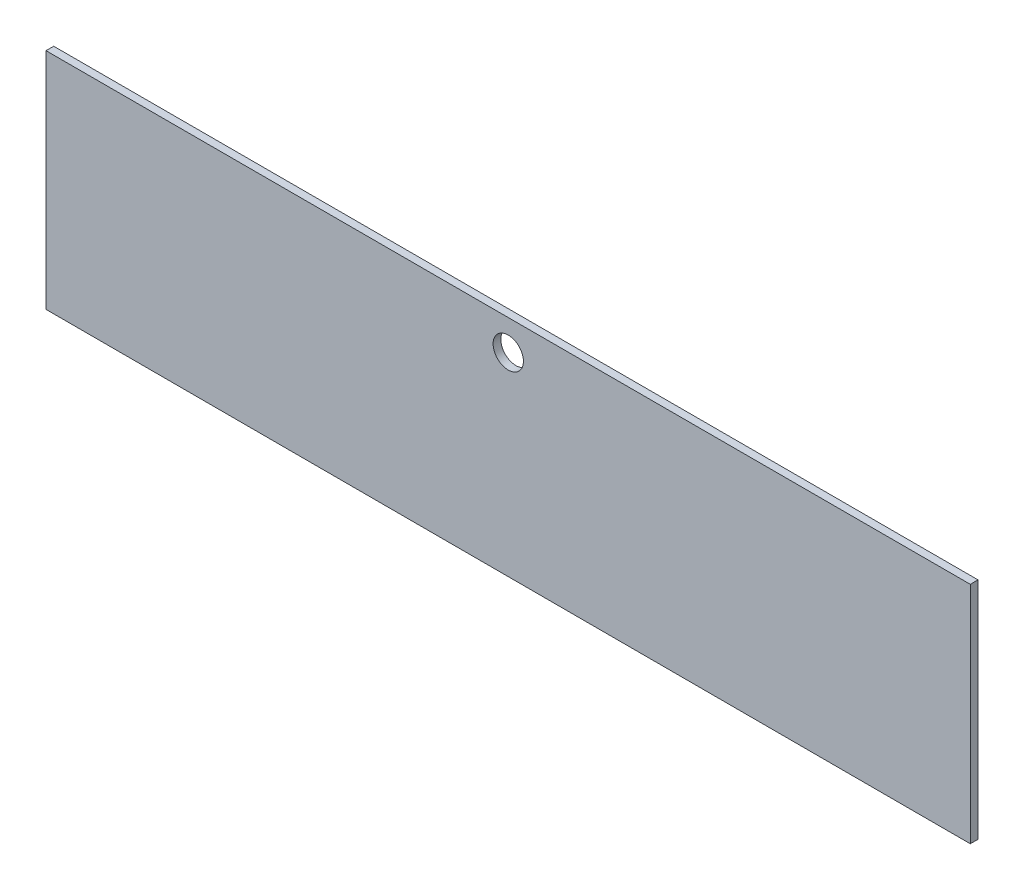
ISO-10303-21;
HEADER;
FILE_DESCRIPTION(('STEP AP214'),'2;1');
FILE_NAME('part.step','',(''),(''),'','','');
FILE_SCHEMA(('AUTOMOTIVE_DESIGN { 1 0 10303 214 1 1 1 1 }'));
ENDSEC;
DATA;
#1=APPLICATION_CONTEXT('core data for automotive mechanical design processes');
#2=APPLICATION_PROTOCOL_DEFINITION('international standard','automotive_design',2000,#1);
#3=PRODUCT_CONTEXT('',#1,'mechanical');
#4=PRODUCT('Part','Part','',(#3));
#5=PRODUCT_RELATED_PRODUCT_CATEGORY('part','',(#4));
#6=PRODUCT_DEFINITION_FORMATION('','',#4);
#7=PRODUCT_DEFINITION_CONTEXT('part definition',#1,'design');
#8=PRODUCT_DEFINITION('design','',#6,#7);
#9=PRODUCT_DEFINITION_SHAPE('','',#8);
#10=(LENGTH_UNIT() NAMED_UNIT(*) SI_UNIT(.MILLI.,.METRE.));
#11=(NAMED_UNIT(*) PLANE_ANGLE_UNIT() SI_UNIT($,.RADIAN.));
#12=(NAMED_UNIT(*) SI_UNIT($,.STERADIAN.) SOLID_ANGLE_UNIT());
#13=UNCERTAINTY_MEASURE_WITH_UNIT(LENGTH_MEASURE(1.E-05),#10,'distance_accuracy_value','');
#14=(GEOMETRIC_REPRESENTATION_CONTEXT(3) GLOBAL_UNCERTAINTY_ASSIGNED_CONTEXT((#13)) GLOBAL_UNIT_ASSIGNED_CONTEXT((#10,
#11,#12)) REPRESENTATION_CONTEXT('',''));
#15=CARTESIAN_POINT('',(0.,0.,0.));
#16=DIRECTION('',(0.,0.,1.));
#17=DIRECTION('',(1.,0.,0.));
#18=AXIS2_PLACEMENT_3D('',#15,#16,#17);
#19=CARTESIAN_POINT('',(380.905750174295,-160.265445134308,6.35));
#20=DIRECTION('',(-1.,0.,0.));
#21=DIRECTION('',(0.,0.,1.));
#22=AXIS2_PLACEMENT_3D('',#19,#20,#21);
#23=PLANE('',#22);
#24=DIRECTION('',(0.,1.,0.));
#25=VECTOR('',#24,1.);
#26=CARTESIAN_POINT('',(380.905750174295,-160.265445134308,0.));
#27=LINE('',#26,#25);
#28=CARTESIAN_POINT('',(380.905750174295,-160.265445134308,0.));
#29=VERTEX_POINT('',#28);
#30=CARTESIAN_POINT('',(380.905750174295,25.,0.));
#31=VERTEX_POINT('',#30);
#32=EDGE_CURVE('E101',#29,#31,#27,.T.);
#33=ORIENTED_EDGE('',*,*,#32,.T.);
#34=DIRECTION('',(0.,0.,-1.));
#35=VECTOR('',#34,1.);
#36=CARTESIAN_POINT('',(380.905750174295,25.,6.35));
#37=LINE('',#36,#35);
#38=CARTESIAN_POINT('',(380.905750174295,25.,6.35));
#39=VERTEX_POINT('',#38);
#40=EDGE_CURVE('E11',#39,#31,#37,.T.);
#41=ORIENTED_EDGE('',*,*,#40,.F.);
#42=DIRECTION('',(0.,1.,0.));
#43=VECTOR('',#42,1.);
#44=CARTESIAN_POINT('',(380.905750174295,-160.265445134308,6.35));
#45=LINE('',#44,#43);
#46=CARTESIAN_POINT('',(380.905750174295,-160.265445134308,6.35));
#47=VERTEX_POINT('',#46);
#48=EDGE_CURVE('E89',#47,#39,#45,.T.);
#49=ORIENTED_EDGE('',*,*,#48,.F.);
#50=DIRECTION('',(0.,0.,-1.));
#51=VECTOR('',#50,1.);
#52=CARTESIAN_POINT('',(380.905750174295,-160.265445134308,6.35));
#53=LINE('',#52,#51);
#54=EDGE_CURVE('E97',#47,#29,#53,.T.);
#55=ORIENTED_EDGE('',*,*,#54,.T.);
#56=EDGE_LOOP('',(#33,#41,#49,#55));
#57=FACE_BOUND('',#56,.T.);
#58=ADVANCED_FACE('F38',(#57),#23,.F.);
#59=CARTESIAN_POINT('',(-381.094249825705,25.,6.35));
#60=DIRECTION('',(0.,-1.,0.));
#61=DIRECTION('',(1.,0.,0.));
#62=AXIS2_PLACEMENT_3D('',#59,#60,#61);
#63=PLANE('',#62);
#64=DIRECTION('',(-1.,0.,0.));
#65=VECTOR('',#64,1.);
#66=CARTESIAN_POINT('',(-381.094249825705,25.,0.));
#67=LINE('',#66,#65);
#68=CARTESIAN_POINT('',(-381.094249825705,25.,0.));
#69=VERTEX_POINT('',#68);
#70=EDGE_CURVE('E93',#31,#69,#67,.T.);
#71=ORIENTED_EDGE('',*,*,#70,.T.);
#72=DIRECTION('',(0.,0.,-1.));
#73=VECTOR('',#72,1.);
#74=CARTESIAN_POINT('',(-381.094249825705,25.,6.35));
#75=LINE('',#74,#73);
#76=CARTESIAN_POINT('',(-381.094249825705,25.,6.35));
#77=VERTEX_POINT('',#76);
#78=EDGE_CURVE('E46',#77,#69,#75,.T.);
#79=ORIENTED_EDGE('',*,*,#78,.F.);
#80=DIRECTION('',(-1.,0.,0.));
#81=VECTOR('',#80,1.);
#82=CARTESIAN_POINT('',(-381.094249825705,25.,6.35));
#83=LINE('',#82,#81);
#84=EDGE_CURVE('E84',#39,#77,#83,.T.);
#85=ORIENTED_EDGE('',*,*,#84,.F.);
#86=ORIENTED_EDGE('',*,*,#40,.T.);
#87=EDGE_LOOP('',(#71,#79,#85,#86));
#88=FACE_BOUND('',#87,.T.);
#89=ADVANCED_FACE('F92',(#88),#63,.F.);
#90=CARTESIAN_POINT('',(-381.094249825705,-159.734501203165,6.35));
#91=DIRECTION('',(1.,0.,0.));
#92=DIRECTION('',(0.,0.,-1.));
#93=AXIS2_PLACEMENT_3D('',#90,#91,#92);
#94=PLANE('',#93);
#95=DIRECTION('',(0.,-1.,0.));
#96=VECTOR('',#95,1.);
#97=CARTESIAN_POINT('',(-381.094249825705,-159.734501203165,0.));
#98=LINE('',#97,#96);
#99=CARTESIAN_POINT('',(-381.094249825705,-159.734501203165,0.));
#100=VERTEX_POINT('',#99);
#101=EDGE_CURVE('E71',#69,#100,#98,.T.);
#102=ORIENTED_EDGE('',*,*,#101,.T.);
#103=DIRECTION('',(0.,0.,-1.));
#104=VECTOR('',#103,1.);
#105=CARTESIAN_POINT('',(-381.094249825705,-159.734501203165,6.35));
#106=LINE('',#105,#104);
#107=CARTESIAN_POINT('',(-381.094249825705,-159.734501203165,6.35));
#108=VERTEX_POINT('',#107);
#109=EDGE_CURVE('E94',#108,#100,#106,.T.);
#110=ORIENTED_EDGE('',*,*,#109,.F.);
#111=DIRECTION('',(0.,-1.,0.));
#112=VECTOR('',#111,1.);
#113=CARTESIAN_POINT('',(-381.094249825705,-159.734501203165,6.35));
#114=LINE('',#113,#112);
#115=EDGE_CURVE('E87',#77,#108,#114,.T.);
#116=ORIENTED_EDGE('',*,*,#115,.F.);
#117=ORIENTED_EDGE('',*,*,#78,.T.);
#118=EDGE_LOOP('',(#102,#110,#116,#117));
#119=FACE_BOUND('',#118,.T.);
#120=ADVANCED_FACE('F95',(#119),#94,.F.);
#121=CARTESIAN_POINT('',(-381.094249825705,-159.734501203165,6.35));
#122=DIRECTION('',(0.000696776643382129,0.999999757251125,0.));
#123=DIRECTION('',(-0.999999757251125,0.000696776643382129,0.));
#124=AXIS2_PLACEMENT_3D('',#121,#122,#123);
#125=PLANE('',#124);
#126=DIRECTION('',(0.999999757251125,-0.000696776643382129,0.));
#127=VECTOR('',#126,1.);
#128=CARTESIAN_POINT('',(-381.094249825705,-159.734501203165,0.));
#129=LINE('',#128,#127);
#130=EDGE_CURVE('E77',#100,#29,#129,.T.);
#131=ORIENTED_EDGE('',*,*,#130,.T.);
#132=ORIENTED_EDGE('',*,*,#54,.F.);
#133=DIRECTION('',(0.999999757251125,-0.000696776643382129,0.));
#134=VECTOR('',#133,1.);
#135=CARTESIAN_POINT('',(-381.094249825705,-159.734501203165,6.35));
#136=LINE('',#135,#134);
#137=EDGE_CURVE('E54',#108,#47,#136,.T.);
#138=ORIENTED_EDGE('',*,*,#137,.F.);
#139=ORIENTED_EDGE('',*,*,#109,.T.);
#140=EDGE_LOOP('',(#131,#132,#138,#139));
#141=FACE_BOUND('',#140,.T.);
#142=ADVANCED_FACE('F109',(#141),#125,.F.);
#143=CARTESIAN_POINT('',(0.,0.,6.35));
#144=DIRECTION('',(0.,0.,-1.));
#145=DIRECTION('',(-1.,0.,0.));
#146=AXIS2_PLACEMENT_3D('',#143,#144,#145);
#147=PLANE('',#146);
#148=CARTESIAN_POINT('',(0.,0.,6.35));
#149=DIRECTION('',(0.,0.,1.));
#150=DIRECTION('',(1.,0.,0.));
#151=AXIS2_PLACEMENT_3D('',#148,#149,#150);
#152=CIRCLE('',#151,12.5);
#153=CARTESIAN_POINT('',(12.5,0.,6.35));
#154=VERTEX_POINT('',#153);
#155=EDGE_CURVE('E115',#154,#154,#152,.T.);
#156=ORIENTED_EDGE('',*,*,#155,.F.);
#157=EDGE_LOOP('',(#156));
#158=FACE_BOUND('',#157,.T.);
#159=ORIENTED_EDGE('',*,*,#48,.T.);
#160=ORIENTED_EDGE('',*,*,#84,.T.);
#161=ORIENTED_EDGE('',*,*,#115,.T.);
#162=ORIENTED_EDGE('',*,*,#137,.T.);
#163=EDGE_LOOP('',(#159,#160,#161,#162));
#164=FACE_BOUND('',#163,.T.);
#165=ADVANCED_FACE('F85',(#158,#164),#147,.F.);
#166=CARTESIAN_POINT('',(0.,0.,0.));
#167=DIRECTION('',(0.,0.,-1.));
#168=DIRECTION('',(-1.,0.,0.));
#169=AXIS2_PLACEMENT_3D('',#166,#167,#168);
#170=PLANE('',#169);
#171=CARTESIAN_POINT('',(0.,0.,0.));
#172=DIRECTION('',(0.,0.,1.));
#173=DIRECTION('',(1.,0.,0.));
#174=AXIS2_PLACEMENT_3D('',#171,#172,#173);
#175=CIRCLE('',#174,12.5);
#176=CARTESIAN_POINT('',(12.5,0.,0.));
#177=VERTEX_POINT('',#176);
#178=EDGE_CURVE('E104',#177,#177,#175,.T.);
#179=ORIENTED_EDGE('',*,*,#178,.T.);
#180=EDGE_LOOP('',(#179));
#181=FACE_BOUND('',#180,.T.);
#182=ORIENTED_EDGE('',*,*,#32,.F.);
#183=ORIENTED_EDGE('',*,*,#130,.F.);
#184=ORIENTED_EDGE('',*,*,#101,.F.);
#185=ORIENTED_EDGE('',*,*,#70,.F.);
#186=EDGE_LOOP('',(#182,#183,#184,#185));
#187=FACE_BOUND('',#186,.T.);
#188=ADVANCED_FACE('F112',(#181,#187),#170,.T.);
#189=CARTESIAN_POINT('',(0.,0.,0.));
#190=DIRECTION('',(0.,0.,1.));
#191=DIRECTION('',(1.,0.,0.));
#192=AXIS2_PLACEMENT_3D('',#189,#190,#191);
#193=CYLINDRICAL_SURFACE('',#192,12.5);
#194=ORIENTED_EDGE('',*,*,#178,.F.);
#195=EDGE_LOOP('',(#194));
#196=FACE_BOUND('',#195,.T.);
#197=ORIENTED_EDGE('',*,*,#155,.T.);
#198=EDGE_LOOP('',(#197));
#199=FACE_BOUND('',#198,.T.);
#200=ADVANCED_FACE('F122',(#196,#199),#193,.F.);
#201=CLOSED_SHELL('',(#58,#89,#120,#142,#165,#188,#200));
#202=MANIFOLD_SOLID_BREP('B2',#201);
#203=ADVANCED_BREP_SHAPE_REPRESENTATION('',(#18,#202),#14);
#204=SHAPE_DEFINITION_REPRESENTATION(#9,#203);
ENDSEC;
END-ISO-10303-21;
